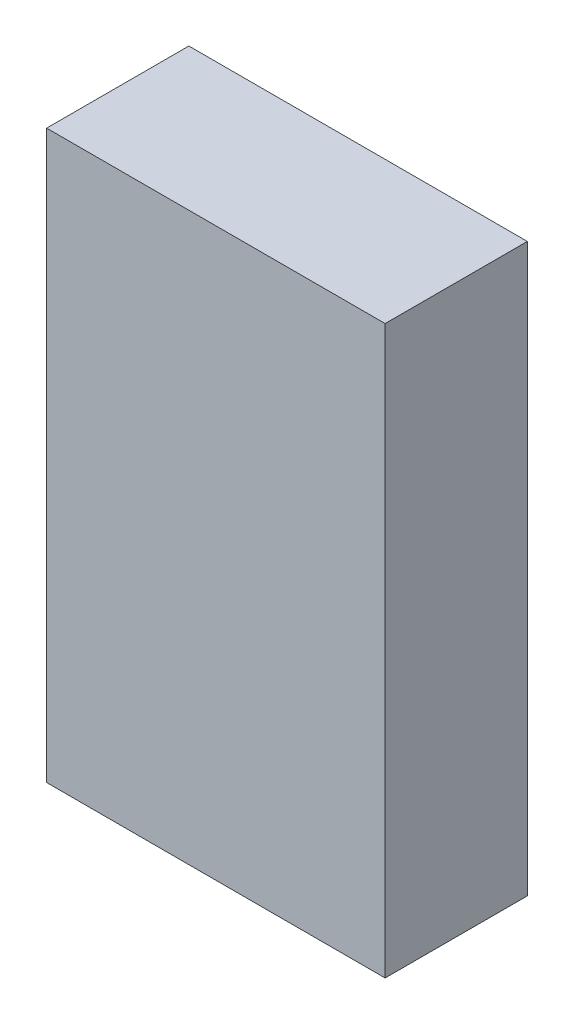
ISO-10303-21;
HEADER;
FILE_DESCRIPTION(('STEP AP214'),'2;1');
FILE_NAME('part.step','',(''),(''),'','','');
FILE_SCHEMA(('AUTOMOTIVE_DESIGN { 1 0 10303 214 1 1 1 1 }'));
ENDSEC;
DATA;
#1=APPLICATION_CONTEXT('core data for automotive mechanical design processes');
#2=APPLICATION_PROTOCOL_DEFINITION('international standard','automotive_design',2000,#1);
#3=PRODUCT_CONTEXT('',#1,'mechanical');
#4=PRODUCT('Part','Part','',(#3));
#5=PRODUCT_RELATED_PRODUCT_CATEGORY('part','',(#4));
#6=PRODUCT_DEFINITION_FORMATION('','',#4);
#7=PRODUCT_DEFINITION_CONTEXT('part definition',#1,'design');
#8=PRODUCT_DEFINITION('design','',#6,#7);
#9=PRODUCT_DEFINITION_SHAPE('','',#8);
#10=(LENGTH_UNIT() NAMED_UNIT(*) SI_UNIT(.MILLI.,.METRE.));
#11=(NAMED_UNIT(*) PLANE_ANGLE_UNIT() SI_UNIT($,.RADIAN.));
#12=(NAMED_UNIT(*) SI_UNIT($,.STERADIAN.) SOLID_ANGLE_UNIT());
#13=UNCERTAINTY_MEASURE_WITH_UNIT(LENGTH_MEASURE(1.E-05),#10,'distance_accuracy_value','');
#14=(GEOMETRIC_REPRESENTATION_CONTEXT(3) GLOBAL_UNCERTAINTY_ASSIGNED_CONTEXT((#13)) GLOBAL_UNIT_ASSIGNED_CONTEXT((#10,
#11,#12)) REPRESENTATION_CONTEXT('',''));
#15=CARTESIAN_POINT('',(0.,0.,0.));
#16=DIRECTION('',(0.,0.,1.));
#17=DIRECTION('',(1.,0.,0.));
#18=AXIS2_PLACEMENT_3D('',#15,#16,#17);
#19=CARTESIAN_POINT('',(-54.61,-91.44,45.8926182380399));
#20=DIRECTION('',(1.,0.,0.));
#21=DIRECTION('',(0.,0.,-1.));
#22=AXIS2_PLACEMENT_3D('',#19,#20,#21);
#23=PLANE('',#22);
#24=DIRECTION('',(0.,-1.,0.));
#25=VECTOR('',#24,1.);
#26=CARTESIAN_POINT('',(-54.61,-91.44,0.));
#27=LINE('',#26,#25);
#28=CARTESIAN_POINT('',(-54.61,91.44,0.));
#29=VERTEX_POINT('',#28);
#30=CARTESIAN_POINT('',(-54.61,-91.44,0.));
#31=VERTEX_POINT('',#30);
#32=EDGE_CURVE('E101',#29,#31,#27,.T.);
#33=ORIENTED_EDGE('',*,*,#32,.T.);
#34=DIRECTION('',(0.,0.,-1.));
#35=VECTOR('',#34,1.);
#36=CARTESIAN_POINT('',(-54.61,-91.44,45.8926182380399));
#37=LINE('',#36,#35);
#38=CARTESIAN_POINT('',(-54.61,-91.44,45.8926182380399));
#39=VERTEX_POINT('',#38);
#40=EDGE_CURVE('E11',#39,#31,#37,.T.);
#41=ORIENTED_EDGE('',*,*,#40,.F.);
#42=DIRECTION('',(0.,-1.,0.));
#43=VECTOR('',#42,1.);
#44=CARTESIAN_POINT('',(-54.61,-91.44,45.8926182380399));
#45=LINE('',#44,#43);
#46=CARTESIAN_POINT('',(-54.61,91.44,45.8926182380399));
#47=VERTEX_POINT('',#46);
#48=EDGE_CURVE('E89',#47,#39,#45,.T.);
#49=ORIENTED_EDGE('',*,*,#48,.F.);
#50=DIRECTION('',(0.,0.,-1.));
#51=VECTOR('',#50,1.);
#52=CARTESIAN_POINT('',(-54.61,91.44,45.8926182380399));
#53=LINE('',#52,#51);
#54=EDGE_CURVE('E97',#47,#29,#53,.T.);
#55=ORIENTED_EDGE('',*,*,#54,.T.);
#56=EDGE_LOOP('',(#33,#41,#49,#55));
#57=FACE_BOUND('',#56,.T.);
#58=ADVANCED_FACE('F38',(#57),#23,.F.);
#59=CARTESIAN_POINT('',(54.61,-91.44,45.8926182380399));
#60=DIRECTION('',(0.,1.,0.));
#61=DIRECTION('',(-1.,0.,0.));
#62=AXIS2_PLACEMENT_3D('',#59,#60,#61);
#63=PLANE('',#62);
#64=DIRECTION('',(1.,0.,0.));
#65=VECTOR('',#64,1.);
#66=CARTESIAN_POINT('',(54.61,-91.44,0.));
#67=LINE('',#66,#65);
#68=CARTESIAN_POINT('',(54.61,-91.44,0.));
#69=VERTEX_POINT('',#68);
#70=EDGE_CURVE('E93',#31,#69,#67,.T.);
#71=ORIENTED_EDGE('',*,*,#70,.T.);
#72=DIRECTION('',(0.,0.,-1.));
#73=VECTOR('',#72,1.);
#74=CARTESIAN_POINT('',(54.61,-91.44,45.8926182380399));
#75=LINE('',#74,#73);
#76=CARTESIAN_POINT('',(54.61,-91.44,45.8926182380399));
#77=VERTEX_POINT('',#76);
#78=EDGE_CURVE('E46',#77,#69,#75,.T.);
#79=ORIENTED_EDGE('',*,*,#78,.F.);
#80=DIRECTION('',(1.,0.,0.));
#81=VECTOR('',#80,1.);
#82=CARTESIAN_POINT('',(54.61,-91.44,45.8926182380399));
#83=LINE('',#82,#81);
#84=EDGE_CURVE('E84',#39,#77,#83,.T.);
#85=ORIENTED_EDGE('',*,*,#84,.F.);
#86=ORIENTED_EDGE('',*,*,#40,.T.);
#87=EDGE_LOOP('',(#71,#79,#85,#86));
#88=FACE_BOUND('',#87,.T.);
#89=ADVANCED_FACE('F92',(#88),#63,.F.);
#90=CARTESIAN_POINT('',(54.61,-91.44,45.8926182380399));
#91=DIRECTION('',(-1.,0.,0.));
#92=DIRECTION('',(0.,0.,1.));
#93=AXIS2_PLACEMENT_3D('',#90,#91,#92);
#94=PLANE('',#93);
#95=DIRECTION('',(0.,1.,0.));
#96=VECTOR('',#95,1.);
#97=CARTESIAN_POINT('',(54.61,-91.44,0.));
#98=LINE('',#97,#96);
#99=CARTESIAN_POINT('',(54.61,91.44,0.));
#100=VERTEX_POINT('',#99);
#101=EDGE_CURVE('E71',#69,#100,#98,.T.);
#102=ORIENTED_EDGE('',*,*,#101,.T.);
#103=DIRECTION('',(0.,0.,-1.));
#104=VECTOR('',#103,1.);
#105=CARTESIAN_POINT('',(54.61,91.44,45.8926182380399));
#106=LINE('',#105,#104);
#107=CARTESIAN_POINT('',(54.61,91.44,45.8926182380399));
#108=VERTEX_POINT('',#107);
#109=EDGE_CURVE('E94',#108,#100,#106,.T.);
#110=ORIENTED_EDGE('',*,*,#109,.F.);
#111=DIRECTION('',(0.,1.,0.));
#112=VECTOR('',#111,1.);
#113=CARTESIAN_POINT('',(54.61,-91.44,45.8926182380399));
#114=LINE('',#113,#112);
#115=EDGE_CURVE('E87',#77,#108,#114,.T.);
#116=ORIENTED_EDGE('',*,*,#115,.F.);
#117=ORIENTED_EDGE('',*,*,#78,.T.);
#118=EDGE_LOOP('',(#102,#110,#116,#117));
#119=FACE_BOUND('',#118,.T.);
#120=ADVANCED_FACE('F95',(#119),#94,.F.);
#121=CARTESIAN_POINT('',(54.61,91.44,45.8926182380399));
#122=DIRECTION('',(0.,-1.,0.));
#123=DIRECTION('',(1.,0.,0.));
#124=AXIS2_PLACEMENT_3D('',#121,#122,#123);
#125=PLANE('',#124);
#126=DIRECTION('',(-1.,0.,0.));
#127=VECTOR('',#126,1.);
#128=CARTESIAN_POINT('',(54.61,91.44,0.));
#129=LINE('',#128,#127);
#130=EDGE_CURVE('E77',#100,#29,#129,.T.);
#131=ORIENTED_EDGE('',*,*,#130,.T.);
#132=ORIENTED_EDGE('',*,*,#54,.F.);
#133=DIRECTION('',(-1.,0.,0.));
#134=VECTOR('',#133,1.);
#135=CARTESIAN_POINT('',(54.61,91.44,45.8926182380399));
#136=LINE('',#135,#134);
#137=EDGE_CURVE('E54',#108,#47,#136,.T.);
#138=ORIENTED_EDGE('',*,*,#137,.F.);
#139=ORIENTED_EDGE('',*,*,#109,.T.);
#140=EDGE_LOOP('',(#131,#132,#138,#139));
#141=FACE_BOUND('',#140,.T.);
#142=ADVANCED_FACE('F108',(#141),#125,.F.);
#143=CARTESIAN_POINT('',(0.,0.,45.8926182380399));
#144=DIRECTION('',(0.,0.,1.));
#145=DIRECTION('',(1.,0.,0.));
#146=AXIS2_PLACEMENT_3D('',#143,#144,#145);
#147=PLANE('',#146);
#148=ORIENTED_EDGE('',*,*,#48,.T.);
#149=ORIENTED_EDGE('',*,*,#84,.T.);
#150=ORIENTED_EDGE('',*,*,#115,.T.);
#151=ORIENTED_EDGE('',*,*,#137,.T.);
#152=EDGE_LOOP('',(#148,#149,#150,#151));
#153=FACE_BOUND('',#152,.T.);
#154=ADVANCED_FACE('F85',(#153),#147,.T.);
#155=CARTESIAN_POINT('',(0.,0.,0.));
#156=DIRECTION('',(0.,0.,1.));
#157=DIRECTION('',(1.,0.,0.));
#158=AXIS2_PLACEMENT_3D('',#155,#156,#157);
#159=PLANE('',#158);
#160=ORIENTED_EDGE('',*,*,#32,.F.);
#161=ORIENTED_EDGE('',*,*,#130,.F.);
#162=ORIENTED_EDGE('',*,*,#101,.F.);
#163=ORIENTED_EDGE('',*,*,#70,.F.);
#164=EDGE_LOOP('',(#160,#161,#162,#163));
#165=FACE_BOUND('',#164,.T.);
#166=ADVANCED_FACE('F111',(#165),#159,.F.);
#167=CLOSED_SHELL('',(#58,#89,#120,#142,#154,#166));
#168=MANIFOLD_SOLID_BREP('B2',#167);
#169=ADVANCED_BREP_SHAPE_REPRESENTATION('',(#18,#168),#14);
#170=SHAPE_DEFINITION_REPRESENTATION(#9,#169);
ENDSEC;
END-ISO-10303-21;
